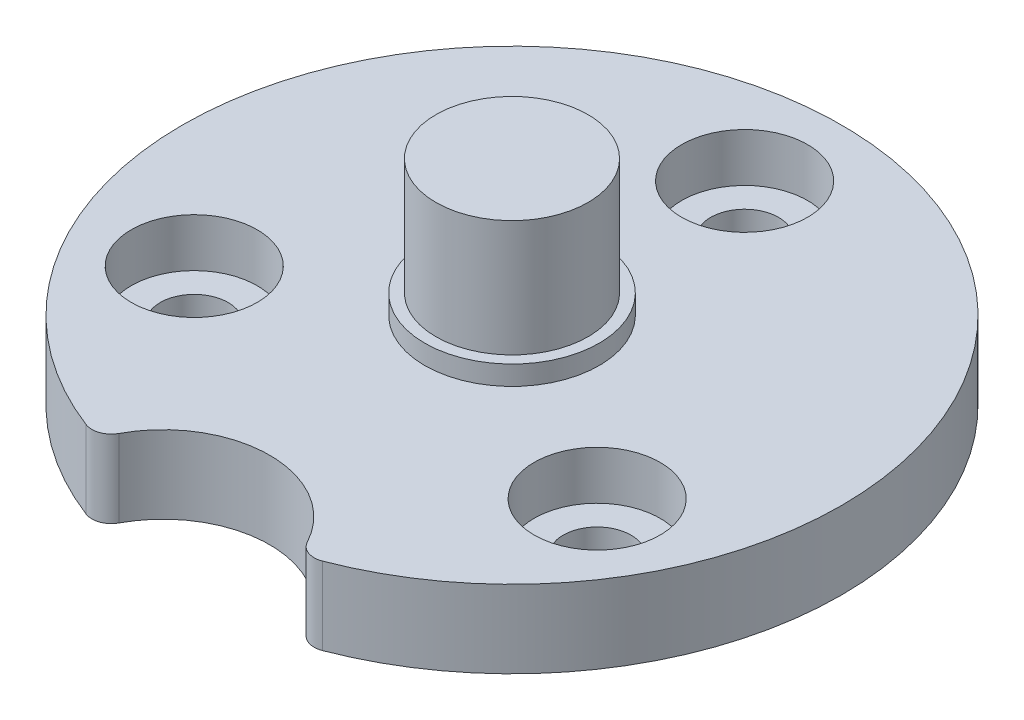
ISO-10303-21;
HEADER;
FILE_DESCRIPTION(('STEP AP214'),'2;1');
FILE_NAME('part.step','',(''),(''),'','','');
FILE_SCHEMA(('AUTOMOTIVE_DESIGN { 1 0 10303 214 1 1 1 1 }'));
ENDSEC;
DATA;
#1=APPLICATION_CONTEXT('core data for automotive mechanical design processes');
#2=APPLICATION_PROTOCOL_DEFINITION('international standard','automotive_design',2000,#1);
#3=PRODUCT_CONTEXT('',#1,'mechanical');
#4=PRODUCT('Part','Part','',(#3));
#5=PRODUCT_RELATED_PRODUCT_CATEGORY('part','',(#4));
#6=PRODUCT_DEFINITION_FORMATION('','',#4);
#7=PRODUCT_DEFINITION_CONTEXT('part definition',#1,'design');
#8=PRODUCT_DEFINITION('design','',#6,#7);
#9=PRODUCT_DEFINITION_SHAPE('','',#8);
#10=(LENGTH_UNIT() NAMED_UNIT(*) SI_UNIT(.MILLI.,.METRE.));
#11=(NAMED_UNIT(*) PLANE_ANGLE_UNIT() SI_UNIT($,.RADIAN.));
#12=(NAMED_UNIT(*) SI_UNIT($,.STERADIAN.) SOLID_ANGLE_UNIT());
#13=UNCERTAINTY_MEASURE_WITH_UNIT(LENGTH_MEASURE(1.E-05),#10,'distance_accuracy_value','');
#14=(GEOMETRIC_REPRESENTATION_CONTEXT(3) GLOBAL_UNCERTAINTY_ASSIGNED_CONTEXT((#13)) GLOBAL_UNIT_ASSIGNED_CONTEXT((#10,
#11,#12)) REPRESENTATION_CONTEXT('',''));
#15=CARTESIAN_POINT('',(0.,0.,0.));
#16=DIRECTION('',(0.,0.,1.));
#17=DIRECTION('',(1.,0.,0.));
#18=AXIS2_PLACEMENT_3D('',#15,#16,#17);
#19=CARTESIAN_POINT('',(0.,4.,-12.));
#20=DIRECTION('',(0.,-1.,0.));
#21=DIRECTION('',(0.,0.,-1.));
#22=AXIS2_PLACEMENT_3D('',#19,#20,#21);
#23=CYLINDRICAL_SURFACE('',#22,1.75);
#24=CARTESIAN_POINT('',(0.,0.,-12.));
#25=DIRECTION('',(0.,1.,0.));
#26=DIRECTION('',(0.,0.,1.));
#27=AXIS2_PLACEMENT_3D('',#24,#25,#26);
#28=CIRCLE('',#27,1.75);
#29=CARTESIAN_POINT('',(0.,0.,-10.25));
#30=VERTEX_POINT('',#29);
#31=EDGE_CURVE('E162',#30,#30,#28,.T.);
#32=ORIENTED_EDGE('',*,*,#31,.F.);
#33=EDGE_LOOP('',(#32));
#34=FACE_BOUND('',#33,.T.);
#35=CARTESIAN_POINT('',(0.,1.5,-12.));
#36=DIRECTION('',(0.,1.,0.));
#37=DIRECTION('',(0.,0.,1.));
#38=AXIS2_PLACEMENT_3D('',#35,#36,#37);
#39=CIRCLE('',#38,1.75);
#40=CARTESIAN_POINT('',(0.,1.5,-10.25));
#41=VERTEX_POINT('',#40);
#42=EDGE_CURVE('E158',#41,#41,#39,.T.);
#43=ORIENTED_EDGE('',*,*,#42,.T.);
#44=EDGE_LOOP('',(#43));
#45=FACE_BOUND('',#44,.T.);
#46=ADVANCED_FACE('F40',(#34,#45),#23,.F.);
#47=CARTESIAN_POINT('',(10.3923048454138,4.,5.99999999999971));
#48=DIRECTION('',(0.,-1.,0.));
#49=DIRECTION('',(0.,0.,-1.));
#50=AXIS2_PLACEMENT_3D('',#47,#48,#49);
#51=CYLINDRICAL_SURFACE('',#50,1.75);
#52=CARTESIAN_POINT('',(10.3923048454138,0.,5.99999999999971));
#53=DIRECTION('',(0.,1.,0.));
#54=DIRECTION('',(0.,0.,1.));
#55=AXIS2_PLACEMENT_3D('',#52,#53,#54);
#56=CIRCLE('',#55,1.75);
#57=CARTESIAN_POINT('',(10.3923048454138,0.,7.74999999999971));
#58=VERTEX_POINT('',#57);
#59=EDGE_CURVE('E157',#58,#58,#56,.T.);
#60=ORIENTED_EDGE('',*,*,#59,.F.);
#61=EDGE_LOOP('',(#60));
#62=FACE_BOUND('',#61,.T.);
#63=CARTESIAN_POINT('',(10.3923048454138,1.5,5.99999999999971));
#64=DIRECTION('',(0.,1.,0.));
#65=DIRECTION('',(0.,0.,1.));
#66=AXIS2_PLACEMENT_3D('',#63,#64,#65);
#67=CIRCLE('',#66,1.75);
#68=CARTESIAN_POINT('',(10.3923048454138,1.5,7.74999999999971));
#69=VERTEX_POINT('',#68);
#70=EDGE_CURVE('E174',#69,#69,#67,.T.);
#71=ORIENTED_EDGE('',*,*,#70,.T.);
#72=EDGE_LOOP('',(#71));
#73=FACE_BOUND('',#72,.T.);
#74=ADVANCED_FACE('F221',(#62,#73),#51,.F.);
#75=CARTESIAN_POINT('',(-10.3923048454128,4.,6.0000000000003));
#76=DIRECTION('',(0.,-1.,0.));
#77=DIRECTION('',(0.,0.,-1.));
#78=AXIS2_PLACEMENT_3D('',#75,#76,#77);
#79=CYLINDRICAL_SURFACE('',#78,1.75);
#80=CARTESIAN_POINT('',(-10.3923048454128,0.,6.0000000000003));
#81=DIRECTION('',(0.,1.,0.));
#82=DIRECTION('',(0.,0.,1.));
#83=AXIS2_PLACEMENT_3D('',#80,#81,#82);
#84=CIRCLE('',#83,1.75);
#85=CARTESIAN_POINT('',(-10.3923048454128,0.,7.7500000000003));
#86=VERTEX_POINT('',#85);
#87=EDGE_CURVE('E153',#86,#86,#84,.T.);
#88=ORIENTED_EDGE('',*,*,#87,.F.);
#89=EDGE_LOOP('',(#88));
#90=FACE_BOUND('',#89,.T.);
#91=CARTESIAN_POINT('',(-10.3923048454128,1.5,6.0000000000003));
#92=DIRECTION('',(0.,1.,0.));
#93=DIRECTION('',(0.,0.,1.));
#94=AXIS2_PLACEMENT_3D('',#91,#92,#93);
#95=CIRCLE('',#94,1.75);
#96=CARTESIAN_POINT('',(-10.3923048454128,1.5,7.7500000000003));
#97=VERTEX_POINT('',#96);
#98=EDGE_CURVE('E133',#97,#97,#95,.T.);
#99=ORIENTED_EDGE('',*,*,#98,.T.);
#100=EDGE_LOOP('',(#99));
#101=FACE_BOUND('',#100,.T.);
#102=ADVANCED_FACE('F195',(#90,#101),#79,.F.);
#103=CARTESIAN_POINT('',(0.,4.,0.));
#104=DIRECTION('',(0.,1.,0.));
#105=DIRECTION('',(0.,0.,1.));
#106=AXIS2_PLACEMENT_3D('',#103,#104,#105);
#107=PLANE('',#106);
#108=CARTESIAN_POINT('',(0.,4.,0.));
#109=DIRECTION('',(0.,1.,0.));
#110=DIRECTION('',(0.,0.,1.));
#111=AXIS2_PLACEMENT_3D('',#108,#109,#110);
#112=CIRCLE('',#111,17.);
#113=CARTESIAN_POINT('',(6.09166505798792,4.,15.87109375));
#114=VERTEX_POINT('',#113);
#115=CARTESIAN_POINT('',(-6.09166505798792,4.,15.87109375));
#116=VERTEX_POINT('',#115);
#117=EDGE_CURVE('E120',#114,#116,#112,.T.);
#118=ORIENTED_EDGE('',*,*,#117,.T.);
#119=CARTESIAN_POINT('',(-5.73333181928275,4.,14.9375));
#120=DIRECTION('',(0.,1.,0.));
#121=DIRECTION('',(0.,0.,1.));
#122=AXIS2_PLACEMENT_3D('',#119,#120,#121);
#123=CIRCLE('',#122,1.);
#124=CARTESIAN_POINT('',(-4.85128077016232,4.,15.4086538461538));
#125=VERTEX_POINT('',#124);
#126=EDGE_CURVE('E11',#116,#125,#123,.T.);
#127=ORIENTED_EDGE('',*,*,#126,.T.);
#128=CARTESIAN_POINT('',(0.,4.,18.));
#129=DIRECTION('',(0.,1.,0.));
#130=DIRECTION('',(0.,0.,1.));
#131=AXIS2_PLACEMENT_3D('',#128,#129,#130);
#132=CIRCLE('',#131,5.5);
#133=CARTESIAN_POINT('',(4.85128077016232,4.,15.4086538461538));
#134=VERTEX_POINT('',#133);
#135=EDGE_CURVE('E99',#134,#125,#132,.T.);
#136=ORIENTED_EDGE('',*,*,#135,.F.);
#137=CARTESIAN_POINT('',(5.73333181928275,4.,14.9375));
#138=DIRECTION('',(0.,1.,0.));
#139=DIRECTION('',(0.,0.,1.));
#140=AXIS2_PLACEMENT_3D('',#137,#138,#139);
#141=CIRCLE('',#140,1.);
#142=EDGE_CURVE('E49',#134,#114,#141,.T.);
#143=ORIENTED_EDGE('',*,*,#142,.T.);
#144=EDGE_LOOP('',(#118,#127,#136,#143));
#145=FACE_BOUND('',#144,.T.);
#146=CARTESIAN_POINT('',(0.,4.,0.));
#147=DIRECTION('',(0.,1.,0.));
#148=DIRECTION('',(0.,0.,1.));
#149=AXIS2_PLACEMENT_3D('',#146,#147,#148);
#150=CIRCLE('',#149,4.5);
#151=CARTESIAN_POINT('',(0.,4.,4.5));
#152=VERTEX_POINT('',#151);
#153=EDGE_CURVE('E112',#152,#152,#150,.T.);
#154=ORIENTED_EDGE('',*,*,#153,.F.);
#155=EDGE_LOOP('',(#154));
#156=FACE_BOUND('',#155,.T.);
#157=CARTESIAN_POINT('',(0.,4.,-12.));
#158=DIRECTION('',(0.,1.,0.));
#159=DIRECTION('',(0.,0.,1.));
#160=AXIS2_PLACEMENT_3D('',#157,#158,#159);
#161=CIRCLE('',#160,3.25);
#162=CARTESIAN_POINT('',(0.,4.,-8.75));
#163=VERTEX_POINT('',#162);
#164=EDGE_CURVE('E134',#163,#163,#161,.T.);
#165=ORIENTED_EDGE('',*,*,#164,.F.);
#166=EDGE_LOOP('',(#165));
#167=FACE_BOUND('',#166,.T.);
#168=CARTESIAN_POINT('',(10.3923048454133,4.,6.));
#169=DIRECTION('',(0.,1.,0.));
#170=DIRECTION('',(0.,0.,1.));
#171=AXIS2_PLACEMENT_3D('',#168,#169,#170);
#172=CIRCLE('',#171,3.25);
#173=CARTESIAN_POINT('',(10.3923048454133,4.,9.25));
#174=VERTEX_POINT('',#173);
#175=EDGE_CURVE('E142',#174,#174,#172,.T.);
#176=ORIENTED_EDGE('',*,*,#175,.F.);
#177=EDGE_LOOP('',(#176));
#178=FACE_BOUND('',#177,.T.);
#179=CARTESIAN_POINT('',(-10.3923048454133,4.,6.00000000000001));
#180=DIRECTION('',(0.,1.,0.));
#181=DIRECTION('',(0.,0.,1.));
#182=AXIS2_PLACEMENT_3D('',#179,#180,#181);
#183=CIRCLE('',#182,3.25);
#184=CARTESIAN_POINT('',(-10.3923048454133,4.,9.25000000000001));
#185=VERTEX_POINT('',#184);
#186=EDGE_CURVE('E125',#185,#185,#183,.T.);
#187=ORIENTED_EDGE('',*,*,#186,.F.);
#188=EDGE_LOOP('',(#187));
#189=FACE_BOUND('',#188,.T.);
#190=ADVANCED_FACE('F192',(#145,#156,#167,#178,#189),#107,.T.);
#191=CARTESIAN_POINT('',(0.,0.,0.));
#192=DIRECTION('',(0.,1.,0.));
#193=DIRECTION('',(0.,0.,1.));
#194=AXIS2_PLACEMENT_3D('',#191,#192,#193);
#195=PLANE('',#194);
#196=CARTESIAN_POINT('',(0.,0.,18.));
#197=DIRECTION('',(0.,1.,0.));
#198=DIRECTION('',(0.,0.,1.));
#199=AXIS2_PLACEMENT_3D('',#196,#197,#198);
#200=CIRCLE('',#199,5.5);
#201=CARTESIAN_POINT('',(-4.85128077016232,0.,15.4086538461538));
#202=VERTEX_POINT('',#201);
#203=CARTESIAN_POINT('',(4.85128077016232,0.,15.4086538461538));
#204=VERTEX_POINT('',#203);
#205=EDGE_CURVE('E97',#202,#204,#200,.F.);
#206=ORIENTED_EDGE('',*,*,#205,.F.);
#207=CARTESIAN_POINT('',(-5.73333181928275,0.,14.9375));
#208=DIRECTION('',(0.,1.,0.));
#209=DIRECTION('',(0.,0.,1.));
#210=AXIS2_PLACEMENT_3D('',#207,#208,#209);
#211=CIRCLE('',#210,1.);
#212=CARTESIAN_POINT('',(-6.09166505798792,0.,15.87109375));
#213=VERTEX_POINT('',#212);
#214=EDGE_CURVE('E80',#202,#213,#211,.F.);
#215=ORIENTED_EDGE('',*,*,#214,.T.);
#216=CARTESIAN_POINT('',(0.,0.,0.));
#217=DIRECTION('',(0.,1.,0.));
#218=DIRECTION('',(0.,0.,1.));
#219=AXIS2_PLACEMENT_3D('',#216,#217,#218);
#220=CIRCLE('',#219,17.);
#221=CARTESIAN_POINT('',(6.09166505798792,0.,15.87109375));
#222=VERTEX_POINT('',#221);
#223=EDGE_CURVE('E166',#222,#213,#220,.T.);
#224=ORIENTED_EDGE('',*,*,#223,.F.);
#225=CARTESIAN_POINT('',(5.73333181928275,0.,14.9375));
#226=DIRECTION('',(0.,1.,0.));
#227=DIRECTION('',(0.,0.,1.));
#228=AXIS2_PLACEMENT_3D('',#225,#226,#227);
#229=CIRCLE('',#228,1.);
#230=EDGE_CURVE('E90',#222,#204,#229,.F.);
#231=ORIENTED_EDGE('',*,*,#230,.T.);
#232=EDGE_LOOP('',(#206,#215,#224,#231));
#233=FACE_BOUND('',#232,.T.);
#234=ORIENTED_EDGE('',*,*,#31,.T.);
#235=EDGE_LOOP('',(#234));
#236=FACE_BOUND('',#235,.T.);
#237=ORIENTED_EDGE('',*,*,#59,.T.);
#238=EDGE_LOOP('',(#237));
#239=FACE_BOUND('',#238,.T.);
#240=ORIENTED_EDGE('',*,*,#87,.T.);
#241=EDGE_LOOP('',(#240));
#242=FACE_BOUND('',#241,.T.);
#243=ADVANCED_FACE('F103',(#233,#236,#239,#242),#195,.F.);
#244=CARTESIAN_POINT('',(0.,4.,0.));
#245=DIRECTION('',(0.,-1.,0.));
#246=DIRECTION('',(0.,0.,-1.));
#247=AXIS2_PLACEMENT_3D('',#244,#245,#246);
#248=CYLINDRICAL_SURFACE('',#247,17.);
#249=ORIENTED_EDGE('',*,*,#223,.T.);
#250=DIRECTION('',(0.,-1.,0.));
#251=VECTOR('',#250,1.);
#252=CARTESIAN_POINT('',(-6.09166505798792,4.,15.87109375));
#253=LINE('',#252,#251);
#254=EDGE_CURVE('E56',#213,#116,#253,.F.);
#255=ORIENTED_EDGE('',*,*,#254,.T.);
#256=ORIENTED_EDGE('',*,*,#117,.F.);
#257=DIRECTION('',(0.,-1.,0.));
#258=VECTOR('',#257,1.);
#259=CARTESIAN_POINT('',(6.09166505798792,4.,15.87109375));
#260=LINE('',#259,#258);
#261=EDGE_CURVE('E89',#114,#222,#260,.T.);
#262=ORIENTED_EDGE('',*,*,#261,.T.);
#263=EDGE_LOOP('',(#249,#255,#256,#262));
#264=FACE_BOUND('',#263,.T.);
#265=ADVANCED_FACE('F190',(#264),#248,.T.);
#266=CARTESIAN_POINT('',(-10.3923048454133,1.5,6.00000000000001));
#267=DIRECTION('',(0.,1.,0.));
#268=DIRECTION('',(0.,0.,1.));
#269=AXIS2_PLACEMENT_3D('',#266,#267,#268);
#270=CYLINDRICAL_SURFACE('',#269,3.25);
#271=CARTESIAN_POINT('',(-10.3923048454133,1.5,6.00000000000001));
#272=DIRECTION('',(0.,1.,0.));
#273=DIRECTION('',(0.,0.,1.));
#274=AXIS2_PLACEMENT_3D('',#271,#272,#273);
#275=CIRCLE('',#274,3.25);
#276=CARTESIAN_POINT('',(-10.3923048454133,1.5,9.25000000000001));
#277=VERTEX_POINT('',#276);
#278=EDGE_CURVE('E146',#277,#277,#275,.T.);
#279=ORIENTED_EDGE('',*,*,#278,.F.);
#280=EDGE_LOOP('',(#279));
#281=FACE_BOUND('',#280,.T.);
#282=ORIENTED_EDGE('',*,*,#186,.T.);
#283=EDGE_LOOP('',(#282));
#284=FACE_BOUND('',#283,.T.);
#285=ADVANCED_FACE('F205',(#281,#284),#270,.F.);
#286=CARTESIAN_POINT('',(-10.3923048454133,1.5,6.00000000000001));
#287=DIRECTION('',(0.,1.,0.));
#288=DIRECTION('',(0.,0.,1.));
#289=AXIS2_PLACEMENT_3D('',#286,#287,#288);
#290=PLANE('',#289);
#291=ORIENTED_EDGE('',*,*,#98,.F.);
#292=EDGE_LOOP('',(#291));
#293=FACE_BOUND('',#292,.T.);
#294=ORIENTED_EDGE('',*,*,#278,.T.);
#295=EDGE_LOOP('',(#294));
#296=FACE_BOUND('',#295,.T.);
#297=ADVANCED_FACE('F207',(#293,#296),#290,.T.);
#298=CARTESIAN_POINT('',(10.3923048454133,1.5,6.));
#299=DIRECTION('',(0.,1.,0.));
#300=DIRECTION('',(0.,0.,1.));
#301=AXIS2_PLACEMENT_3D('',#298,#299,#300);
#302=CYLINDRICAL_SURFACE('',#301,3.25);
#303=CARTESIAN_POINT('',(10.3923048454133,1.5,6.));
#304=DIRECTION('',(0.,1.,0.));
#305=DIRECTION('',(0.,0.,1.));
#306=AXIS2_PLACEMENT_3D('',#303,#304,#305);
#307=CIRCLE('',#306,3.25);
#308=CARTESIAN_POINT('',(10.3923048454133,1.5,9.25));
#309=VERTEX_POINT('',#308);
#310=EDGE_CURVE('E138',#309,#309,#307,.T.);
#311=ORIENTED_EDGE('',*,*,#310,.F.);
#312=EDGE_LOOP('',(#311));
#313=FACE_BOUND('',#312,.T.);
#314=ORIENTED_EDGE('',*,*,#175,.T.);
#315=EDGE_LOOP('',(#314));
#316=FACE_BOUND('',#315,.T.);
#317=ADVANCED_FACE('F214',(#313,#316),#302,.F.);
#318=CARTESIAN_POINT('',(10.3923048454133,1.5,6.));
#319=DIRECTION('',(0.,1.,0.));
#320=DIRECTION('',(0.,0.,1.));
#321=AXIS2_PLACEMENT_3D('',#318,#319,#320);
#322=PLANE('',#321);
#323=ORIENTED_EDGE('',*,*,#70,.F.);
#324=EDGE_LOOP('',(#323));
#325=FACE_BOUND('',#324,.T.);
#326=ORIENTED_EDGE('',*,*,#310,.T.);
#327=EDGE_LOOP('',(#326));
#328=FACE_BOUND('',#327,.T.);
#329=ADVANCED_FACE('F265',(#325,#328),#322,.T.);
#330=CARTESIAN_POINT('',(0.,1.5,-12.));
#331=DIRECTION('',(0.,1.,0.));
#332=DIRECTION('',(0.,0.,1.));
#333=AXIS2_PLACEMENT_3D('',#330,#331,#332);
#334=CYLINDRICAL_SURFACE('',#333,3.25);
#335=CARTESIAN_POINT('',(0.,1.5,-12.));
#336=DIRECTION('',(0.,1.,0.));
#337=DIRECTION('',(0.,0.,1.));
#338=AXIS2_PLACEMENT_3D('',#335,#336,#337);
#339=CIRCLE('',#338,3.25);
#340=CARTESIAN_POINT('',(0.,1.5,-8.75));
#341=VERTEX_POINT('',#340);
#342=EDGE_CURVE('E129',#341,#341,#339,.T.);
#343=ORIENTED_EDGE('',*,*,#342,.F.);
#344=EDGE_LOOP('',(#343));
#345=FACE_BOUND('',#344,.T.);
#346=ORIENTED_EDGE('',*,*,#164,.T.);
#347=EDGE_LOOP('',(#346));
#348=FACE_BOUND('',#347,.T.);
#349=ADVANCED_FACE('F261',(#345,#348),#334,.F.);
#350=CARTESIAN_POINT('',(0.,1.5,-12.));
#351=DIRECTION('',(0.,1.,0.));
#352=DIRECTION('',(0.,0.,1.));
#353=AXIS2_PLACEMENT_3D('',#350,#351,#352);
#354=PLANE('',#353);
#355=ORIENTED_EDGE('',*,*,#42,.F.);
#356=EDGE_LOOP('',(#355));
#357=FACE_BOUND('',#356,.T.);
#358=ORIENTED_EDGE('',*,*,#342,.T.);
#359=EDGE_LOOP('',(#358));
#360=FACE_BOUND('',#359,.T.);
#361=ADVANCED_FACE('F257',(#357,#360),#354,.T.);
#362=CARTESIAN_POINT('',(0.,5.,0.));
#363=DIRECTION('',(0.,-1.,0.));
#364=DIRECTION('',(0.,0.,-1.));
#365=AXIS2_PLACEMENT_3D('',#362,#363,#364);
#366=CYLINDRICAL_SURFACE('',#365,4.5);
#367=CARTESIAN_POINT('',(0.,5.,0.));
#368=DIRECTION('',(0.,1.,0.));
#369=DIRECTION('',(0.,0.,1.));
#370=AXIS2_PLACEMENT_3D('',#367,#368,#369);
#371=CIRCLE('',#370,4.5);
#372=CARTESIAN_POINT('',(0.,5.,4.5));
#373=VERTEX_POINT('',#372);
#374=EDGE_CURVE('E121',#373,#373,#371,.T.);
#375=ORIENTED_EDGE('',*,*,#374,.F.);
#376=EDGE_LOOP('',(#375));
#377=FACE_BOUND('',#376,.T.);
#378=ORIENTED_EDGE('',*,*,#153,.T.);
#379=EDGE_LOOP('',(#378));
#380=FACE_BOUND('',#379,.T.);
#381=ADVANCED_FACE('F253',(#377,#380),#366,.T.);
#382=CARTESIAN_POINT('',(0.,5.,0.));
#383=DIRECTION('',(0.,1.,0.));
#384=DIRECTION('',(0.,0.,1.));
#385=AXIS2_PLACEMENT_3D('',#382,#383,#384);
#386=PLANE('',#385);
#387=CARTESIAN_POINT('',(0.,5.,0.));
#388=DIRECTION('',(0.,1.,0.));
#389=DIRECTION('',(0.,0.,1.));
#390=AXIS2_PLACEMENT_3D('',#387,#388,#389);
#391=CIRCLE('',#390,3.925);
#392=CARTESIAN_POINT('',(0.,5.,3.925));
#393=VERTEX_POINT('',#392);
#394=EDGE_CURVE('E116',#393,#393,#391,.T.);
#395=ORIENTED_EDGE('',*,*,#394,.F.);
#396=EDGE_LOOP('',(#395));
#397=FACE_BOUND('',#396,.T.);
#398=ORIENTED_EDGE('',*,*,#374,.T.);
#399=EDGE_LOOP('',(#398));
#400=FACE_BOUND('',#399,.T.);
#401=ADVANCED_FACE('F249',(#397,#400),#386,.T.);
#402=CARTESIAN_POINT('',(0.,11.,0.));
#403=DIRECTION('',(0.,-1.,0.));
#404=DIRECTION('',(0.,0.,-1.));
#405=AXIS2_PLACEMENT_3D('',#402,#403,#404);
#406=CYLINDRICAL_SURFACE('',#405,3.925);
#407=CARTESIAN_POINT('',(0.,11.,0.));
#408=DIRECTION('',(0.,1.,0.));
#409=DIRECTION('',(0.,0.,1.));
#410=AXIS2_PLACEMENT_3D('',#407,#408,#409);
#411=CIRCLE('',#410,3.925);
#412=CARTESIAN_POINT('',(0.,11.,3.925));
#413=VERTEX_POINT('',#412);
#414=EDGE_CURVE('E107',#413,#413,#411,.T.);
#415=ORIENTED_EDGE('',*,*,#414,.F.);
#416=EDGE_LOOP('',(#415));
#417=FACE_BOUND('',#416,.T.);
#418=ORIENTED_EDGE('',*,*,#394,.T.);
#419=EDGE_LOOP('',(#418));
#420=FACE_BOUND('',#419,.T.);
#421=ADVANCED_FACE('F243',(#417,#420),#406,.T.);
#422=CARTESIAN_POINT('',(0.,11.,0.));
#423=DIRECTION('',(0.,1.,0.));
#424=DIRECTION('',(0.,0.,1.));
#425=AXIS2_PLACEMENT_3D('',#422,#423,#424);
#426=PLANE('',#425);
#427=ORIENTED_EDGE('',*,*,#414,.T.);
#428=EDGE_LOOP('',(#427));
#429=FACE_BOUND('',#428,.T.);
#430=ADVANCED_FACE('F238',(#429),#426,.T.);
#431=CARTESIAN_POINT('',(0.,-0.00100000000000013,18.));
#432=DIRECTION('',(0.,1.,0.));
#433=DIRECTION('',(0.,0.,1.));
#434=AXIS2_PLACEMENT_3D('',#431,#432,#433);
#435=CYLINDRICAL_SURFACE('',#434,5.5);
#436=ORIENTED_EDGE('',*,*,#135,.T.);
#437=DIRECTION('',(0.,1.,0.));
#438=VECTOR('',#437,1.);
#439=CARTESIAN_POINT('',(-4.85128077016232,-0.00100000000000013,15.4086538461538));
#440=LINE('',#439,#438);
#441=EDGE_CURVE('E84',#125,#202,#440,.F.);
#442=ORIENTED_EDGE('',*,*,#441,.T.);
#443=ORIENTED_EDGE('',*,*,#205,.T.);
#444=DIRECTION('',(0.,1.,0.));
#445=VECTOR('',#444,1.);
#446=CARTESIAN_POINT('',(4.85128077016232,-0.00100000000000013,15.4086538461538));
#447=LINE('',#446,#445);
#448=EDGE_CURVE('E101',#204,#134,#447,.T.);
#449=ORIENTED_EDGE('',*,*,#448,.T.);
#450=EDGE_LOOP('',(#436,#442,#443,#449));
#451=FACE_BOUND('',#450,.T.);
#452=ADVANCED_FACE('F95',(#451),#435,.F.);
#453=CARTESIAN_POINT('',(-5.73333181928275,4.,14.9375));
#454=DIRECTION('',(0.,1.,0.));
#455=DIRECTION('',(0.,0.,1.));
#456=AXIS2_PLACEMENT_3D('',#453,#454,#455);
#457=CYLINDRICAL_SURFACE('',#456,1.);
#458=ORIENTED_EDGE('',*,*,#126,.F.);
#459=ORIENTED_EDGE('',*,*,#254,.F.);
#460=ORIENTED_EDGE('',*,*,#214,.F.);
#461=ORIENTED_EDGE('',*,*,#441,.F.);
#462=EDGE_LOOP('',(#458,#459,#460,#461));
#463=FACE_BOUND('',#462,.T.);
#464=ADVANCED_FACE('F83',(#463),#457,.T.);
#465=CARTESIAN_POINT('',(5.73333181928275,4.,14.9375));
#466=DIRECTION('',(0.,-1.,0.));
#467=DIRECTION('',(0.,0.,-1.));
#468=AXIS2_PLACEMENT_3D('',#465,#466,#467);
#469=CYLINDRICAL_SURFACE('',#468,1.);
#470=ORIENTED_EDGE('',*,*,#230,.F.);
#471=ORIENTED_EDGE('',*,*,#261,.F.);
#472=ORIENTED_EDGE('',*,*,#142,.F.);
#473=ORIENTED_EDGE('',*,*,#448,.F.);
#474=EDGE_LOOP('',(#470,#471,#472,#473));
#475=FACE_BOUND('',#474,.T.);
#476=ADVANCED_FACE('F42',(#475),#469,.T.);
#477=CLOSED_SHELL('',(#46,#74,#102,#190,#243,#265,#285,#297,#317,#329,#349,#361,#381,#401,#421,
#430,#452,#464,#476));
#478=MANIFOLD_SOLID_BREP('B2',#477);
#479=ADVANCED_BREP_SHAPE_REPRESENTATION('',(#18,#478),#14);
#480=SHAPE_DEFINITION_REPRESENTATION(#9,#479);
ENDSEC;
END-ISO-10303-21;
